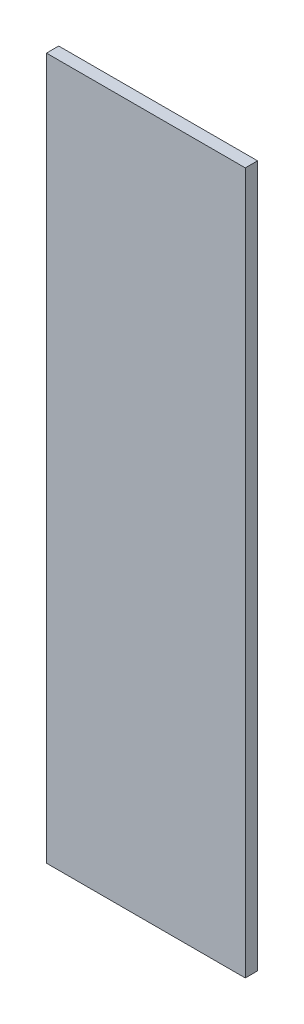
ISO-10303-21;
HEADER;
FILE_DESCRIPTION(('STEP AP214'),'2;1');
FILE_NAME('part.step','',(''),(''),'','','');
FILE_SCHEMA(('AUTOMOTIVE_DESIGN { 1 0 10303 214 1 1 1 1 }'));
ENDSEC;
DATA;
#1=APPLICATION_CONTEXT('core data for automotive mechanical design processes');
#2=APPLICATION_PROTOCOL_DEFINITION('international standard','automotive_design',2000,#1);
#3=PRODUCT_CONTEXT('',#1,'mechanical');
#4=PRODUCT('Part','Part','',(#3));
#5=PRODUCT_RELATED_PRODUCT_CATEGORY('part','',(#4));
#6=PRODUCT_DEFINITION_FORMATION('','',#4);
#7=PRODUCT_DEFINITION_CONTEXT('part definition',#1,'design');
#8=PRODUCT_DEFINITION('design','',#6,#7);
#9=PRODUCT_DEFINITION_SHAPE('','',#8);
#10=(LENGTH_UNIT() NAMED_UNIT(*) SI_UNIT(.MILLI.,.METRE.));
#11=(NAMED_UNIT(*) PLANE_ANGLE_UNIT() SI_UNIT($,.RADIAN.));
#12=(NAMED_UNIT(*) SI_UNIT($,.STERADIAN.) SOLID_ANGLE_UNIT());
#13=UNCERTAINTY_MEASURE_WITH_UNIT(LENGTH_MEASURE(1.E-05),#10,'distance_accuracy_value','');
#14=(GEOMETRIC_REPRESENTATION_CONTEXT(3) GLOBAL_UNCERTAINTY_ASSIGNED_CONTEXT((#13)) GLOBAL_UNIT_ASSIGNED_CONTEXT((#10,
#11,#12)) REPRESENTATION_CONTEXT('',''));
#15=CARTESIAN_POINT('',(0.,0.,0.));
#16=DIRECTION('',(0.,0.,1.));
#17=DIRECTION('',(1.,0.,0.));
#18=AXIS2_PLACEMENT_3D('',#15,#16,#17);
#19=CARTESIAN_POINT('',(-971.578947368421,1061.84210526316,40.));
#20=DIRECTION('',(1.,0.,0.));
#21=DIRECTION('',(0.,1.,0.));
#22=AXIS2_PLACEMENT_3D('',#19,#20,#21);
#23=PLANE('',#22);
#24=DIRECTION('',(0.,-1.,0.));
#25=VECTOR('',#24,1.);
#26=CARTESIAN_POINT('',(-971.578947368421,1061.84210526316,0.));
#27=LINE('',#26,#25);
#28=CARTESIAN_POINT('',(-971.578947368421,1061.84210526316,0.));
#29=VERTEX_POINT('',#28);
#30=CARTESIAN_POINT('',(-971.578947368421,-1228.15789473684,0.));
#31=VERTEX_POINT('',#30);
#32=EDGE_CURVE('E96',#29,#31,#27,.T.);
#33=ORIENTED_EDGE('',*,*,#32,.T.);
#34=DIRECTION('',(0.,0.,-1.));
#35=VECTOR('',#34,1.);
#36=CARTESIAN_POINT('',(-971.578947368421,-1228.15789473684,40.));
#37=LINE('',#36,#35);
#38=CARTESIAN_POINT('',(-971.578947368421,-1228.15789473684,40.));
#39=VERTEX_POINT('',#38);
#40=EDGE_CURVE('E11',#39,#31,#37,.T.);
#41=ORIENTED_EDGE('',*,*,#40,.F.);
#42=DIRECTION('',(0.,-1.,0.));
#43=VECTOR('',#42,1.);
#44=CARTESIAN_POINT('',(-971.578947368421,1061.84210526316,40.));
#45=LINE('',#44,#43);
#46=CARTESIAN_POINT('',(-971.578947368421,1061.84210526316,40.));
#47=VERTEX_POINT('',#46);
#48=EDGE_CURVE('E84',#47,#39,#45,.T.);
#49=ORIENTED_EDGE('',*,*,#48,.F.);
#50=DIRECTION('',(0.,0.,-1.));
#51=VECTOR('',#50,1.);
#52=CARTESIAN_POINT('',(-971.578947368421,1061.84210526316,40.));
#53=LINE('',#52,#51);
#54=EDGE_CURVE('E92',#47,#29,#53,.T.);
#55=ORIENTED_EDGE('',*,*,#54,.T.);
#56=EDGE_LOOP('',(#33,#41,#49,#55));
#57=FACE_BOUND('',#56,.T.);
#58=ADVANCED_FACE('F33',(#57),#23,.F.);
#59=CARTESIAN_POINT('',(-971.578947368421,-1228.15789473684,40.));
#60=DIRECTION('',(0.,1.,0.));
#61=DIRECTION('',(0.,0.,1.));
#62=AXIS2_PLACEMENT_3D('',#59,#60,#61);
#63=PLANE('',#62);
#64=DIRECTION('',(1.,0.,0.));
#65=VECTOR('',#64,1.);
#66=CARTESIAN_POINT('',(-971.578947368421,-1228.15789473684,0.));
#67=LINE('',#66,#65);
#68=CARTESIAN_POINT('',(-322.578947368421,-1228.15789473684,0.));
#69=VERTEX_POINT('',#68);
#70=EDGE_CURVE('E88',#31,#69,#67,.T.);
#71=ORIENTED_EDGE('',*,*,#70,.T.);
#72=DIRECTION('',(0.,0.,-1.));
#73=VECTOR('',#72,1.);
#74=CARTESIAN_POINT('',(-322.578947368421,-1228.15789473684,40.));
#75=LINE('',#74,#73);
#76=CARTESIAN_POINT('',(-322.578947368421,-1228.15789473684,40.));
#77=VERTEX_POINT('',#76);
#78=EDGE_CURVE('E41',#77,#69,#75,.T.);
#79=ORIENTED_EDGE('',*,*,#78,.F.);
#80=DIRECTION('',(1.,0.,0.));
#81=VECTOR('',#80,1.);
#82=CARTESIAN_POINT('',(-971.578947368421,-1228.15789473684,40.));
#83=LINE('',#82,#81);
#84=EDGE_CURVE('E79',#39,#77,#83,.T.);
#85=ORIENTED_EDGE('',*,*,#84,.F.);
#86=ORIENTED_EDGE('',*,*,#40,.T.);
#87=EDGE_LOOP('',(#71,#79,#85,#86));
#88=FACE_BOUND('',#87,.T.);
#89=ADVANCED_FACE('F87',(#88),#63,.F.);
#90=CARTESIAN_POINT('',(-322.578947368421,1061.84210526316,40.));
#91=DIRECTION('',(-1.,0.,0.));
#92=DIRECTION('',(0.,-1.,0.));
#93=AXIS2_PLACEMENT_3D('',#90,#91,#92);
#94=PLANE('',#93);
#95=DIRECTION('',(0.,1.,0.));
#96=VECTOR('',#95,1.);
#97=CARTESIAN_POINT('',(-322.578947368421,1061.84210526316,0.));
#98=LINE('',#97,#96);
#99=CARTESIAN_POINT('',(-322.578947368421,1061.84210526316,0.));
#100=VERTEX_POINT('',#99);
#101=EDGE_CURVE('E66',#69,#100,#98,.T.);
#102=ORIENTED_EDGE('',*,*,#101,.T.);
#103=DIRECTION('',(0.,0.,-1.));
#104=VECTOR('',#103,1.);
#105=CARTESIAN_POINT('',(-322.578947368421,1061.84210526316,40.));
#106=LINE('',#105,#104);
#107=CARTESIAN_POINT('',(-322.578947368421,1061.84210526316,40.));
#108=VERTEX_POINT('',#107);
#109=EDGE_CURVE('E89',#108,#100,#106,.T.);
#110=ORIENTED_EDGE('',*,*,#109,.F.);
#111=DIRECTION('',(0.,1.,0.));
#112=VECTOR('',#111,1.);
#113=CARTESIAN_POINT('',(-322.578947368421,1061.84210526316,40.));
#114=LINE('',#113,#112);
#115=EDGE_CURVE('E82',#77,#108,#114,.T.);
#116=ORIENTED_EDGE('',*,*,#115,.F.);
#117=ORIENTED_EDGE('',*,*,#78,.T.);
#118=EDGE_LOOP('',(#102,#110,#116,#117));
#119=FACE_BOUND('',#118,.T.);
#120=ADVANCED_FACE('F90',(#119),#94,.F.);
#121=CARTESIAN_POINT('',(-971.578947368421,1061.84210526316,40.));
#122=DIRECTION('',(0.,-1.,0.));
#123=DIRECTION('',(0.,0.,-1.));
#124=AXIS2_PLACEMENT_3D('',#121,#122,#123);
#125=PLANE('',#124);
#126=DIRECTION('',(-1.,0.,0.));
#127=VECTOR('',#126,1.);
#128=CARTESIAN_POINT('',(-971.578947368421,1061.84210526316,0.));
#129=LINE('',#128,#127);
#130=EDGE_CURVE('E72',#100,#29,#129,.T.);
#131=ORIENTED_EDGE('',*,*,#130,.T.);
#132=ORIENTED_EDGE('',*,*,#54,.F.);
#133=DIRECTION('',(-1.,0.,0.));
#134=VECTOR('',#133,1.);
#135=CARTESIAN_POINT('',(-971.578947368421,1061.84210526316,40.));
#136=LINE('',#135,#134);
#137=EDGE_CURVE('E49',#108,#47,#136,.T.);
#138=ORIENTED_EDGE('',*,*,#137,.F.);
#139=ORIENTED_EDGE('',*,*,#109,.T.);
#140=EDGE_LOOP('',(#131,#132,#138,#139));
#141=FACE_BOUND('',#140,.T.);
#142=ADVANCED_FACE('F103',(#141),#125,.F.);
#143=CARTESIAN_POINT('',(0.,0.,40.));
#144=DIRECTION('',(0.,0.,1.));
#145=DIRECTION('',(1.,0.,0.));
#146=AXIS2_PLACEMENT_3D('',#143,#144,#145);
#147=PLANE('',#146);
#148=ORIENTED_EDGE('',*,*,#48,.T.);
#149=ORIENTED_EDGE('',*,*,#84,.T.);
#150=ORIENTED_EDGE('',*,*,#115,.T.);
#151=ORIENTED_EDGE('',*,*,#137,.T.);
#152=EDGE_LOOP('',(#148,#149,#150,#151));
#153=FACE_BOUND('',#152,.T.);
#154=ADVANCED_FACE('F80',(#153),#147,.T.);
#155=CARTESIAN_POINT('',(0.,0.,0.));
#156=DIRECTION('',(0.,0.,1.));
#157=DIRECTION('',(1.,0.,0.));
#158=AXIS2_PLACEMENT_3D('',#155,#156,#157);
#159=PLANE('',#158);
#160=ORIENTED_EDGE('',*,*,#32,.F.);
#161=ORIENTED_EDGE('',*,*,#130,.F.);
#162=ORIENTED_EDGE('',*,*,#101,.F.);
#163=ORIENTED_EDGE('',*,*,#70,.F.);
#164=EDGE_LOOP('',(#160,#161,#162,#163));
#165=FACE_BOUND('',#164,.T.);
#166=ADVANCED_FACE('F106',(#165),#159,.F.);
#167=CLOSED_SHELL('',(#58,#89,#120,#142,#154,#166));
#168=MANIFOLD_SOLID_BREP('B2',#167);
#169=ADVANCED_BREP_SHAPE_REPRESENTATION('',(#18,#168),#14);
#170=SHAPE_DEFINITION_REPRESENTATION(#9,#169);
ENDSEC;
END-ISO-10303-21;
